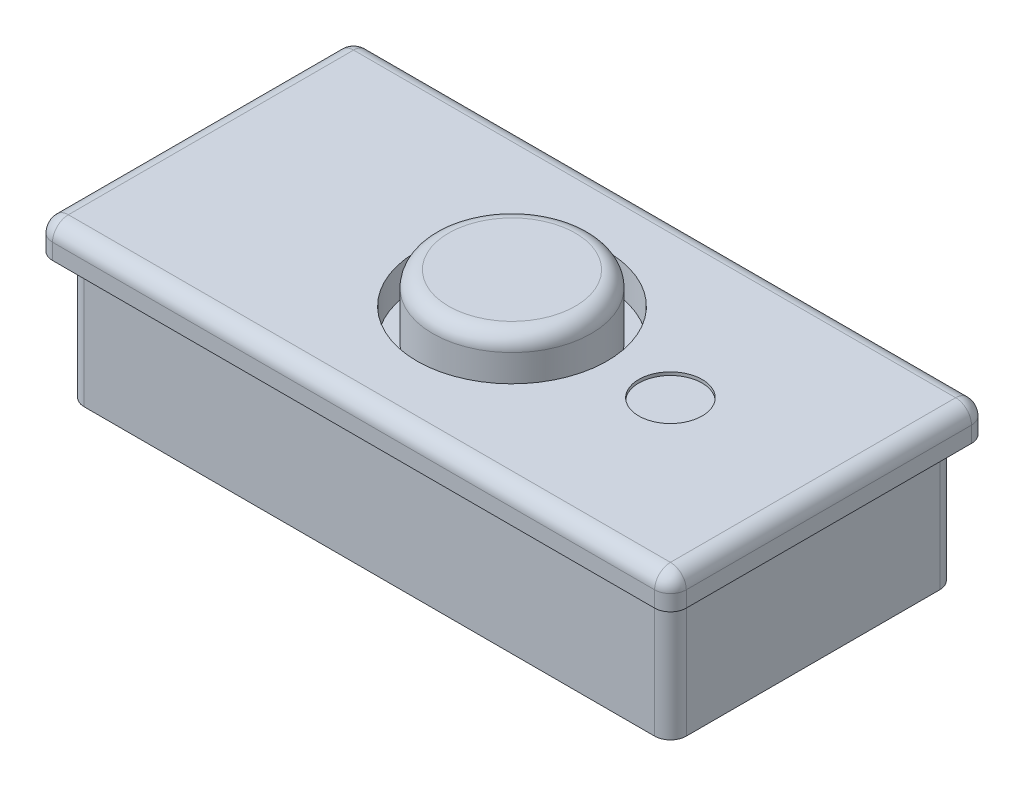
ISO-10303-21;
HEADER;
FILE_DESCRIPTION(('STEP AP214'),'2;1');
FILE_NAME('part.step','',(''),(''),'','','');
FILE_SCHEMA(('AUTOMOTIVE_DESIGN { 1 0 10303 214 1 1 1 1 }'));
ENDSEC;
DATA;
#1=APPLICATION_CONTEXT('core data for automotive mechanical design processes');
#2=APPLICATION_PROTOCOL_DEFINITION('international standard','automotive_design',2000,#1);
#3=PRODUCT_CONTEXT('',#1,'mechanical');
#4=PRODUCT('Part','Part','',(#3));
#5=PRODUCT_RELATED_PRODUCT_CATEGORY('part','',(#4));
#6=PRODUCT_DEFINITION_FORMATION('','',#4);
#7=PRODUCT_DEFINITION_CONTEXT('part definition',#1,'design');
#8=PRODUCT_DEFINITION('design','',#6,#7);
#9=PRODUCT_DEFINITION_SHAPE('','',#8);
#10=(LENGTH_UNIT() NAMED_UNIT(*) SI_UNIT(.MILLI.,.METRE.));
#11=(NAMED_UNIT(*) PLANE_ANGLE_UNIT() SI_UNIT($,.RADIAN.));
#12=(NAMED_UNIT(*) SI_UNIT($,.STERADIAN.) SOLID_ANGLE_UNIT());
#13=UNCERTAINTY_MEASURE_WITH_UNIT(LENGTH_MEASURE(1.E-05),#10,'distance_accuracy_value','');
#14=(GEOMETRIC_REPRESENTATION_CONTEXT(3) GLOBAL_UNCERTAINTY_ASSIGNED_CONTEXT((#13)) GLOBAL_UNIT_ASSIGNED_CONTEXT((#10,
#11,#12)) REPRESENTATION_CONTEXT('',''));
#15=CARTESIAN_POINT('',(0.,0.,0.));
#16=DIRECTION('',(0.,0.,1.));
#17=DIRECTION('',(1.,0.,0.));
#18=AXIS2_PLACEMENT_3D('',#15,#16,#17);
#19=CARTESIAN_POINT('',(1.,0.,-1.));
#20=DIRECTION('',(0.,-1.,0.));
#21=DIRECTION('',(0.,0.,-1.));
#22=AXIS2_PLACEMENT_3D('',#19,#20,#21);
#23=PLANE('',#22);
#24=CARTESIAN_POINT('',(1.,0.,-1.));
#25=DIRECTION('',(0.,1.,0.));
#26=DIRECTION('',(0.,0.,-1.));
#27=AXIS2_PLACEMENT_3D('',#24,#25,#26);
#28=CIRCLE('',#27,1.);
#29=CARTESIAN_POINT('',(0.,0.,-1.00000000000001));
#30=VERTEX_POINT('',#29);
#31=CARTESIAN_POINT('',(1.00000000000001,0.,0.));
#32=VERTEX_POINT('',#31);
#33=EDGE_CURVE('E249',#30,#32,#28,.T.);
#34=ORIENTED_EDGE('',*,*,#33,.F.);
#35=DIRECTION('',(0.,0.,1.));
#36=VECTOR('',#35,1.);
#37=CARTESIAN_POINT('',(0.,0.,-1.00000000000001));
#38=LINE('',#37,#36);
#39=CARTESIAN_POINT('',(0.,0.,-19.));
#40=VERTEX_POINT('',#39);
#41=EDGE_CURVE('E272',#40,#30,#38,.T.);
#42=ORIENTED_EDGE('',*,*,#41,.F.);
#43=CARTESIAN_POINT('',(1.,0.,-19.));
#44=DIRECTION('',(0.,1.,0.));
#45=DIRECTION('',(0.,0.,-1.));
#46=AXIS2_PLACEMENT_3D('',#43,#44,#45);
#47=CIRCLE('',#46,1.);
#48=CARTESIAN_POINT('',(1.00000000000001,0.,-20.));
#49=VERTEX_POINT('',#48);
#50=EDGE_CURVE('E269',#49,#40,#47,.T.);
#51=ORIENTED_EDGE('',*,*,#50,.F.);
#52=DIRECTION('',(-1.,0.,0.));
#53=VECTOR('',#52,1.);
#54=CARTESIAN_POINT('',(1.00000000000001,0.,-20.));
#55=LINE('',#54,#53);
#56=CARTESIAN_POINT('',(39.,0.,-20.));
#57=VERTEX_POINT('',#56);
#58=EDGE_CURVE('E266',#57,#49,#55,.T.);
#59=ORIENTED_EDGE('',*,*,#58,.F.);
#60=CARTESIAN_POINT('',(39.,0.,-19.));
#61=DIRECTION('',(0.,1.,0.));
#62=DIRECTION('',(0.,0.,-1.));
#63=AXIS2_PLACEMENT_3D('',#60,#61,#62);
#64=CIRCLE('',#63,1.);
#65=CARTESIAN_POINT('',(40.,0.,-19.));
#66=VERTEX_POINT('',#65);
#67=EDGE_CURVE('E263',#66,#57,#64,.T.);
#68=ORIENTED_EDGE('',*,*,#67,.F.);
#69=DIRECTION('',(0.,0.,-1.));
#70=VECTOR('',#69,1.);
#71=CARTESIAN_POINT('',(40.,0.,-1.));
#72=LINE('',#71,#70);
#73=CARTESIAN_POINT('',(40.,0.,-1.));
#74=VERTEX_POINT('',#73);
#75=EDGE_CURVE('E260',#74,#66,#72,.T.);
#76=ORIENTED_EDGE('',*,*,#75,.F.);
#77=CARTESIAN_POINT('',(39.,0.,-1.));
#78=DIRECTION('',(0.,1.,0.));
#79=DIRECTION('',(0.,0.,1.));
#80=AXIS2_PLACEMENT_3D('',#77,#78,#79);
#81=CIRCLE('',#80,1.);
#82=CARTESIAN_POINT('',(39.,0.,0.));
#83=VERTEX_POINT('',#82);
#84=EDGE_CURVE('E257',#83,#74,#81,.T.);
#85=ORIENTED_EDGE('',*,*,#84,.F.);
#86=DIRECTION('',(1.,0.,0.));
#87=VECTOR('',#86,1.);
#88=CARTESIAN_POINT('',(1.00000000000001,0.,0.));
#89=LINE('',#88,#87);
#90=EDGE_CURVE('E254',#32,#83,#89,.T.);
#91=ORIENTED_EDGE('',*,*,#90,.F.);
#92=EDGE_LOOP('',(#34,#42,#51,#59,#68,#76,#85,#91));
#93=FACE_BOUND('',#92,.T.);
#94=DIRECTION('',(1.,0.,0.));
#95=VECTOR('',#94,1.);
#96=CARTESIAN_POINT('',(2.00000000000001,0.,-1.));
#97=LINE('',#96,#95);
#98=CARTESIAN_POINT('',(2.00000000000001,0.,-1.));
#99=VERTEX_POINT('',#98);
#100=CARTESIAN_POINT('',(38.,0.,-1.));
#101=VERTEX_POINT('',#100);
#102=EDGE_CURVE('E193',#99,#101,#97,.T.);
#103=ORIENTED_EDGE('',*,*,#102,.T.);
#104=CARTESIAN_POINT('',(38.,0.,-2.));
#105=DIRECTION('',(0.,1.,0.));
#106=DIRECTION('',(0.,0.,1.));
#107=AXIS2_PLACEMENT_3D('',#104,#105,#106);
#108=CIRCLE('',#107,1.);
#109=CARTESIAN_POINT('',(39.,0.,-2.));
#110=VERTEX_POINT('',#109);
#111=EDGE_CURVE('E216',#101,#110,#108,.T.);
#112=ORIENTED_EDGE('',*,*,#111,.T.);
#113=DIRECTION('',(0.,0.,-1.));
#114=VECTOR('',#113,1.);
#115=CARTESIAN_POINT('',(39.,0.,-2.));
#116=LINE('',#115,#114);
#117=CARTESIAN_POINT('',(39.,0.,-18.));
#118=VERTEX_POINT('',#117);
#119=EDGE_CURVE('E172',#110,#118,#116,.T.);
#120=ORIENTED_EDGE('',*,*,#119,.T.);
#121=CARTESIAN_POINT('',(38.,0.,-18.));
#122=DIRECTION('',(0.,1.,0.));
#123=DIRECTION('',(0.,0.,1.));
#124=AXIS2_PLACEMENT_3D('',#121,#122,#123);
#125=CIRCLE('',#124,1.);
#126=CARTESIAN_POINT('',(38.,0.,-19.));
#127=VERTEX_POINT('',#126);
#128=EDGE_CURVE('E219',#118,#127,#125,.T.);
#129=ORIENTED_EDGE('',*,*,#128,.T.);
#130=DIRECTION('',(-1.,0.,0.));
#131=VECTOR('',#130,1.);
#132=CARTESIAN_POINT('',(2.00000000000001,0.,-19.));
#133=LINE('',#132,#131);
#134=CARTESIAN_POINT('',(2.00000000000001,0.,-19.));
#135=VERTEX_POINT('',#134);
#136=EDGE_CURVE('E222',#127,#135,#133,.T.);
#137=ORIENTED_EDGE('',*,*,#136,.T.);
#138=CARTESIAN_POINT('',(2.,0.,-18.));
#139=DIRECTION('',(0.,1.,0.));
#140=DIRECTION('',(0.,0.,1.));
#141=AXIS2_PLACEMENT_3D('',#138,#139,#140);
#142=CIRCLE('',#141,1.);
#143=CARTESIAN_POINT('',(0.999999999999999,0.,-18.));
#144=VERTEX_POINT('',#143);
#145=EDGE_CURVE('E225',#135,#144,#142,.T.);
#146=ORIENTED_EDGE('',*,*,#145,.T.);
#147=DIRECTION('',(0.,0.,1.));
#148=VECTOR('',#147,1.);
#149=CARTESIAN_POINT('',(0.999999999999999,0.,-2.00000000000001));
#150=LINE('',#149,#148);
#151=CARTESIAN_POINT('',(0.999999999999999,0.,-2.00000000000001));
#152=VERTEX_POINT('',#151);
#153=EDGE_CURVE('E228',#144,#152,#150,.T.);
#154=ORIENTED_EDGE('',*,*,#153,.T.);
#155=CARTESIAN_POINT('',(2.,0.,-2.));
#156=DIRECTION('',(0.,1.,0.));
#157=DIRECTION('',(0.,0.,-1.));
#158=AXIS2_PLACEMENT_3D('',#155,#156,#157);
#159=CIRCLE('',#158,1.);
#160=EDGE_CURVE('E196',#152,#99,#159,.T.);
#161=ORIENTED_EDGE('',*,*,#160,.T.);
#162=EDGE_LOOP('',(#103,#112,#120,#129,#137,#146,#154,#161));
#163=FACE_BOUND('',#162,.T.);
#164=ADVANCED_FACE('F39',(#93,#163),#23,.T.);
#165=CARTESIAN_POINT('',(1.,2.,-1.));
#166=DIRECTION('',(0.,-1.,0.));
#167=DIRECTION('',(0.,0.,-1.));
#168=AXIS2_PLACEMENT_3D('',#165,#166,#167);
#169=PLANE('',#168);
#170=DIRECTION('',(0.,0.,1.));
#171=VECTOR('',#170,1.);
#172=CARTESIAN_POINT('',(1.,2.,-1.));
#173=LINE('',#172,#171);
#174=CARTESIAN_POINT('',(1.,2.,-19.));
#175=VERTEX_POINT('',#174);
#176=CARTESIAN_POINT('',(1.,2.,-1.));
#177=VERTEX_POINT('',#176);
#178=EDGE_CURVE('E298',#175,#177,#173,.T.);
#179=ORIENTED_EDGE('',*,*,#178,.T.);
#180=DIRECTION('',(1.,0.,0.));
#181=VECTOR('',#180,1.);
#182=CARTESIAN_POINT('',(1.,2.,-1.));
#183=LINE('',#182,#181);
#184=CARTESIAN_POINT('',(39.,2.,-1.));
#185=VERTEX_POINT('',#184);
#186=EDGE_CURVE('E300',#177,#185,#183,.T.);
#187=ORIENTED_EDGE('',*,*,#186,.T.);
#188=DIRECTION('',(0.,0.,-1.));
#189=VECTOR('',#188,1.);
#190=CARTESIAN_POINT('',(39.,2.,-1.));
#191=LINE('',#190,#189);
#192=CARTESIAN_POINT('',(39.,2.,-19.));
#193=VERTEX_POINT('',#192);
#194=EDGE_CURVE('E294',#185,#193,#191,.T.);
#195=ORIENTED_EDGE('',*,*,#194,.T.);
#196=DIRECTION('',(-1.,0.,0.));
#197=VECTOR('',#196,1.);
#198=CARTESIAN_POINT('',(1.,2.,-19.));
#199=LINE('',#198,#197);
#200=EDGE_CURVE('E296',#193,#175,#199,.T.);
#201=ORIENTED_EDGE('',*,*,#200,.T.);
#202=EDGE_LOOP('',(#179,#187,#195,#201));
#203=FACE_BOUND('',#202,.T.);
#204=CARTESIAN_POINT('',(30.,2.,-10.));
#205=DIRECTION('',(0.,1.,0.));
#206=DIRECTION('',(0.,0.,1.));
#207=AXIS2_PLACEMENT_3D('',#204,#205,#206);
#208=CIRCLE('',#207,2.);
#209=CARTESIAN_POINT('',(30.,2.,-8.));
#210=VERTEX_POINT('',#209);
#211=EDGE_CURVE('E339',#210,#210,#208,.T.);
#212=ORIENTED_EDGE('',*,*,#211,.F.);
#213=EDGE_LOOP('',(#212));
#214=FACE_BOUND('',#213,.T.);
#215=CARTESIAN_POINT('',(20.,2.,-10.));
#216=DIRECTION('',(0.,1.,0.));
#217=DIRECTION('',(0.,0.,1.));
#218=AXIS2_PLACEMENT_3D('',#215,#216,#217);
#219=CIRCLE('',#218,6.);
#220=CARTESIAN_POINT('',(20.,2.,-4.));
#221=VERTEX_POINT('',#220);
#222=EDGE_CURVE('E246',#221,#221,#219,.T.);
#223=ORIENTED_EDGE('',*,*,#222,.F.);
#224=EDGE_LOOP('',(#223));
#225=FACE_BOUND('',#224,.T.);
#226=ADVANCED_FACE('F378',(#203,#214,#225),#169,.F.);
#227=CARTESIAN_POINT('',(1.,2.,-1.));
#228=DIRECTION('',(0.,-1.,0.));
#229=DIRECTION('',(0.,0.,-1.));
#230=AXIS2_PLACEMENT_3D('',#227,#228,#229);
#231=CYLINDRICAL_SURFACE('',#230,1.);
#232=DIRECTION('',(0.,-1.,0.));
#233=VECTOR('',#232,1.);
#234=CARTESIAN_POINT('',(1.00000000000001,2.,0.));
#235=LINE('',#234,#233);
#236=CARTESIAN_POINT('',(1.00000000000001,1.,0.));
#237=VERTEX_POINT('',#236);
#238=EDGE_CURVE('E289',#237,#32,#235,.T.);
#239=ORIENTED_EDGE('',*,*,#238,.F.);
#240=CARTESIAN_POINT('',(1.,1.,-1.));
#241=DIRECTION('',(0.,-1.,0.));
#242=DIRECTION('',(0.,0.,-1.));
#243=AXIS2_PLACEMENT_3D('',#240,#241,#242);
#244=CIRCLE('',#243,1.);
#245=CARTESIAN_POINT('',(0.,1.,-1.00000000000001));
#246=VERTEX_POINT('',#245);
#247=EDGE_CURVE('E305',#237,#246,#244,.T.);
#248=ORIENTED_EDGE('',*,*,#247,.T.);
#249=DIRECTION('',(0.,-1.,0.));
#250=VECTOR('',#249,1.);
#251=CARTESIAN_POINT('',(0.,2.,-1.00000000000001));
#252=LINE('',#251,#250);
#253=EDGE_CURVE('E275',#246,#30,#252,.T.);
#254=ORIENTED_EDGE('',*,*,#253,.T.);
#255=ORIENTED_EDGE('',*,*,#33,.T.);
#256=EDGE_LOOP('',(#239,#248,#254,#255));
#257=FACE_BOUND('',#256,.T.);
#258=ADVANCED_FACE('F384',(#257),#231,.T.);
#259=CARTESIAN_POINT('',(1.00000000000001,2.,0.));
#260=DIRECTION('',(0.,0.,-1.));
#261=DIRECTION('',(-1.,0.,0.));
#262=AXIS2_PLACEMENT_3D('',#259,#260,#261);
#263=PLANE('',#262);
#264=DIRECTION('',(0.,-1.,0.));
#265=VECTOR('',#264,1.);
#266=CARTESIAN_POINT('',(39.,2.,0.));
#267=LINE('',#266,#265);
#268=CARTESIAN_POINT('',(39.,1.,0.));
#269=VERTEX_POINT('',#268);
#270=EDGE_CURVE('E287',#269,#83,#267,.T.);
#271=ORIENTED_EDGE('',*,*,#270,.F.);
#272=DIRECTION('',(1.,0.,0.));
#273=VECTOR('',#272,1.);
#274=CARTESIAN_POINT('',(1.00000000000001,1.,0.));
#275=LINE('',#274,#273);
#276=EDGE_CURVE('E303',#269,#237,#275,.F.);
#277=ORIENTED_EDGE('',*,*,#276,.T.);
#278=ORIENTED_EDGE('',*,*,#238,.T.);
#279=ORIENTED_EDGE('',*,*,#90,.T.);
#280=EDGE_LOOP('',(#271,#277,#278,#279));
#281=FACE_BOUND('',#280,.T.);
#282=ADVANCED_FACE('F405',(#281),#263,.F.);
#283=CARTESIAN_POINT('',(39.,2.,-1.));
#284=DIRECTION('',(0.,-1.,0.));
#285=DIRECTION('',(0.,0.,-1.));
#286=AXIS2_PLACEMENT_3D('',#283,#284,#285);
#287=CYLINDRICAL_SURFACE('',#286,1.);
#288=DIRECTION('',(0.,-1.,0.));
#289=VECTOR('',#288,1.);
#290=CARTESIAN_POINT('',(40.,2.,-1.));
#291=LINE('',#290,#289);
#292=CARTESIAN_POINT('',(40.,1.,-1.));
#293=VERTEX_POINT('',#292);
#294=EDGE_CURVE('E285',#293,#74,#291,.T.);
#295=ORIENTED_EDGE('',*,*,#294,.F.);
#296=CARTESIAN_POINT('',(39.,1.,-1.));
#297=DIRECTION('',(0.,-1.,0.));
#298=DIRECTION('',(0.,0.,-1.));
#299=AXIS2_PLACEMENT_3D('',#296,#297,#298);
#300=CIRCLE('',#299,1.);
#301=EDGE_CURVE('E291',#293,#269,#300,.T.);
#302=ORIENTED_EDGE('',*,*,#301,.T.);
#303=ORIENTED_EDGE('',*,*,#270,.T.);
#304=ORIENTED_EDGE('',*,*,#84,.T.);
#305=EDGE_LOOP('',(#295,#302,#303,#304));
#306=FACE_BOUND('',#305,.T.);
#307=ADVANCED_FACE('F401',(#306),#287,.T.);
#308=CARTESIAN_POINT('',(40.,2.,-1.));
#309=DIRECTION('',(-1.,0.,0.));
#310=DIRECTION('',(0.,0.,1.));
#311=AXIS2_PLACEMENT_3D('',#308,#309,#310);
#312=PLANE('',#311);
#313=DIRECTION('',(0.,-1.,0.));
#314=VECTOR('',#313,1.);
#315=CARTESIAN_POINT('',(40.,2.,-19.));
#316=LINE('',#315,#314);
#317=CARTESIAN_POINT('',(40.,1.,-19.));
#318=VERTEX_POINT('',#317);
#319=EDGE_CURVE('E283',#318,#66,#316,.T.);
#320=ORIENTED_EDGE('',*,*,#319,.F.);
#321=DIRECTION('',(0.,0.,-1.));
#322=VECTOR('',#321,1.);
#323=CARTESIAN_POINT('',(40.,1.,-1.));
#324=LINE('',#323,#322);
#325=EDGE_CURVE('E313',#318,#293,#324,.F.);
#326=ORIENTED_EDGE('',*,*,#325,.T.);
#327=ORIENTED_EDGE('',*,*,#294,.T.);
#328=ORIENTED_EDGE('',*,*,#75,.T.);
#329=EDGE_LOOP('',(#320,#326,#327,#328));
#330=FACE_BOUND('',#329,.T.);
#331=ADVANCED_FACE('F398',(#330),#312,.F.);
#332=CARTESIAN_POINT('',(39.,2.,-19.));
#333=DIRECTION('',(0.,-1.,0.));
#334=DIRECTION('',(0.,0.,-1.));
#335=AXIS2_PLACEMENT_3D('',#332,#333,#334);
#336=CYLINDRICAL_SURFACE('',#335,1.);
#337=DIRECTION('',(0.,-1.,0.));
#338=VECTOR('',#337,1.);
#339=CARTESIAN_POINT('',(39.,2.,-20.));
#340=LINE('',#339,#338);
#341=CARTESIAN_POINT('',(39.,1.,-20.));
#342=VERTEX_POINT('',#341);
#343=EDGE_CURVE('E281',#342,#57,#340,.T.);
#344=ORIENTED_EDGE('',*,*,#343,.F.);
#345=CARTESIAN_POINT('',(39.,1.,-19.));
#346=DIRECTION('',(0.,-1.,0.));
#347=DIRECTION('',(0.,0.,-1.));
#348=AXIS2_PLACEMENT_3D('',#345,#346,#347);
#349=CIRCLE('',#348,1.);
#350=EDGE_CURVE('E56',#342,#318,#349,.T.);
#351=ORIENTED_EDGE('',*,*,#350,.T.);
#352=ORIENTED_EDGE('',*,*,#319,.T.);
#353=ORIENTED_EDGE('',*,*,#67,.T.);
#354=EDGE_LOOP('',(#344,#351,#352,#353));
#355=FACE_BOUND('',#354,.T.);
#356=ADVANCED_FACE('F395',(#355),#336,.T.);
#357=CARTESIAN_POINT('',(1.00000000000001,2.,-20.));
#358=DIRECTION('',(0.,0.,1.));
#359=DIRECTION('',(1.,0.,0.));
#360=AXIS2_PLACEMENT_3D('',#357,#358,#359);
#361=PLANE('',#360);
#362=DIRECTION('',(0.,-1.,0.));
#363=VECTOR('',#362,1.);
#364=CARTESIAN_POINT('',(1.00000000000001,2.,-20.));
#365=LINE('',#364,#363);
#366=CARTESIAN_POINT('',(1.00000000000001,1.,-20.));
#367=VERTEX_POINT('',#366);
#368=EDGE_CURVE('E279',#367,#49,#365,.T.);
#369=ORIENTED_EDGE('',*,*,#368,.F.);
#370=DIRECTION('',(-1.,0.,0.));
#371=VECTOR('',#370,1.);
#372=CARTESIAN_POINT('',(1.00000000000001,1.,-20.));
#373=LINE('',#372,#371);
#374=EDGE_CURVE('E64',#367,#342,#373,.F.);
#375=ORIENTED_EDGE('',*,*,#374,.T.);
#376=ORIENTED_EDGE('',*,*,#343,.T.);
#377=ORIENTED_EDGE('',*,*,#58,.T.);
#378=EDGE_LOOP('',(#369,#375,#376,#377));
#379=FACE_BOUND('',#378,.T.);
#380=ADVANCED_FACE('F391',(#379),#361,.F.);
#381=CARTESIAN_POINT('',(1.,2.,-19.));
#382=DIRECTION('',(0.,-1.,0.));
#383=DIRECTION('',(0.,0.,-1.));
#384=AXIS2_PLACEMENT_3D('',#381,#382,#383);
#385=CYLINDRICAL_SURFACE('',#384,1.);
#386=DIRECTION('',(0.,-1.,0.));
#387=VECTOR('',#386,1.);
#388=CARTESIAN_POINT('',(0.,2.,-19.));
#389=LINE('',#388,#387);
#390=CARTESIAN_POINT('',(0.,1.,-19.));
#391=VERTEX_POINT('',#390);
#392=EDGE_CURVE('E277',#391,#40,#389,.T.);
#393=ORIENTED_EDGE('',*,*,#392,.F.);
#394=CARTESIAN_POINT('',(1.,1.,-19.));
#395=DIRECTION('',(0.,-1.,0.));
#396=DIRECTION('',(0.,0.,-1.));
#397=AXIS2_PLACEMENT_3D('',#394,#395,#396);
#398=CIRCLE('',#397,1.);
#399=EDGE_CURVE('E309',#391,#367,#398,.T.);
#400=ORIENTED_EDGE('',*,*,#399,.T.);
#401=ORIENTED_EDGE('',*,*,#368,.T.);
#402=ORIENTED_EDGE('',*,*,#50,.T.);
#403=EDGE_LOOP('',(#393,#400,#401,#402));
#404=FACE_BOUND('',#403,.T.);
#405=ADVANCED_FACE('F373',(#404),#385,.T.);
#406=CARTESIAN_POINT('',(0.,2.,-1.00000000000001));
#407=DIRECTION('',(1.,0.,0.));
#408=DIRECTION('',(0.,0.,-1.));
#409=AXIS2_PLACEMENT_3D('',#406,#407,#408);
#410=PLANE('',#409);
#411=ORIENTED_EDGE('',*,*,#253,.F.);
#412=DIRECTION('',(0.,0.,1.));
#413=VECTOR('',#412,1.);
#414=CARTESIAN_POINT('',(0.,1.,-1.00000000000001));
#415=LINE('',#414,#413);
#416=EDGE_CURVE('E307',#246,#391,#415,.F.);
#417=ORIENTED_EDGE('',*,*,#416,.T.);
#418=ORIENTED_EDGE('',*,*,#392,.T.);
#419=ORIENTED_EDGE('',*,*,#41,.T.);
#420=EDGE_LOOP('',(#411,#417,#418,#419));
#421=FACE_BOUND('',#420,.T.);
#422=ADVANCED_FACE('F364',(#421),#410,.F.);
#423=CARTESIAN_POINT('',(20.,2.,-10.));
#424=DIRECTION('',(0.,-1.,0.));
#425=DIRECTION('',(0.,0.,-1.));
#426=AXIS2_PLACEMENT_3D('',#423,#424,#425);
#427=CYLINDRICAL_SURFACE('',#426,6.);
#428=ORIENTED_EDGE('',*,*,#222,.T.);
#429=EDGE_LOOP('',(#428));
#430=FACE_BOUND('',#429,.T.);
#431=CARTESIAN_POINT('',(20.,0.,-10.));
#432=DIRECTION('',(0.,1.,0.));
#433=DIRECTION('',(0.,0.,1.));
#434=AXIS2_PLACEMENT_3D('',#431,#432,#433);
#435=CIRCLE('',#434,6.);
#436=CARTESIAN_POINT('',(20.,0.,-4.));
#437=VERTEX_POINT('',#436);
#438=EDGE_CURVE('E234',#437,#437,#435,.T.);
#439=ORIENTED_EDGE('',*,*,#438,.F.);
#440=EDGE_LOOP('',(#439));
#441=FACE_BOUND('',#440,.T.);
#442=ADVANCED_FACE('F362',(#430,#441),#427,.F.);
#443=CARTESIAN_POINT('',(38.,-8.,-2.));
#444=DIRECTION('',(0.,1.,0.));
#445=DIRECTION('',(0.,0.,1.));
#446=AXIS2_PLACEMENT_3D('',#443,#444,#445);
#447=PLANE('',#446);
#448=CARTESIAN_POINT('',(38.,-8.,-2.));
#449=DIRECTION('',(0.,1.,0.));
#450=DIRECTION('',(0.,0.,1.));
#451=AXIS2_PLACEMENT_3D('',#448,#449,#450);
#452=CIRCLE('',#451,1.);
#453=CARTESIAN_POINT('',(38.,-8.,-1.));
#454=VERTEX_POINT('',#453);
#455=CARTESIAN_POINT('',(39.,-8.,-2.));
#456=VERTEX_POINT('',#455);
#457=EDGE_CURVE('E184',#454,#456,#452,.T.);
#458=ORIENTED_EDGE('',*,*,#457,.F.);
#459=DIRECTION('',(1.,0.,0.));
#460=VECTOR('',#459,1.);
#461=CARTESIAN_POINT('',(2.00000000000001,-8.,-1.));
#462=LINE('',#461,#460);
#463=CARTESIAN_POINT('',(2.00000000000001,-8.,-1.));
#464=VERTEX_POINT('',#463);
#465=EDGE_CURVE('E177',#464,#454,#462,.T.);
#466=ORIENTED_EDGE('',*,*,#465,.F.);
#467=CARTESIAN_POINT('',(2.,-8.,-2.));
#468=DIRECTION('',(0.,1.,0.));
#469=DIRECTION('',(0.,0.,-1.));
#470=AXIS2_PLACEMENT_3D('',#467,#468,#469);
#471=CIRCLE('',#470,1.);
#472=CARTESIAN_POINT('',(0.999999999999999,-8.,-2.00000000000001));
#473=VERTEX_POINT('',#472);
#474=EDGE_CURVE('E212',#473,#464,#471,.T.);
#475=ORIENTED_EDGE('',*,*,#474,.F.);
#476=DIRECTION('',(0.,0.,1.));
#477=VECTOR('',#476,1.);
#478=CARTESIAN_POINT('',(0.999999999999999,-8.,-2.00000000000001));
#479=LINE('',#478,#477);
#480=CARTESIAN_POINT('',(0.999999999999999,-8.,-18.));
#481=VERTEX_POINT('',#480);
#482=EDGE_CURVE('E209',#481,#473,#479,.T.);
#483=ORIENTED_EDGE('',*,*,#482,.F.);
#484=CARTESIAN_POINT('',(2.,-8.,-18.));
#485=DIRECTION('',(0.,1.,0.));
#486=DIRECTION('',(0.,0.,1.));
#487=AXIS2_PLACEMENT_3D('',#484,#485,#486);
#488=CIRCLE('',#487,1.);
#489=CARTESIAN_POINT('',(2.00000000000001,-8.,-19.));
#490=VERTEX_POINT('',#489);
#491=EDGE_CURVE('E206',#490,#481,#488,.T.);
#492=ORIENTED_EDGE('',*,*,#491,.F.);
#493=DIRECTION('',(-1.,0.,0.));
#494=VECTOR('',#493,1.);
#495=CARTESIAN_POINT('',(2.00000000000001,-8.,-19.));
#496=LINE('',#495,#494);
#497=CARTESIAN_POINT('',(38.,-8.,-19.));
#498=VERTEX_POINT('',#497);
#499=EDGE_CURVE('E203',#498,#490,#496,.T.);
#500=ORIENTED_EDGE('',*,*,#499,.F.);
#501=CARTESIAN_POINT('',(38.,-8.,-18.));
#502=DIRECTION('',(0.,1.,0.));
#503=DIRECTION('',(0.,0.,1.));
#504=AXIS2_PLACEMENT_3D('',#501,#502,#503);
#505=CIRCLE('',#504,1.);
#506=CARTESIAN_POINT('',(39.,-8.,-18.));
#507=VERTEX_POINT('',#506);
#508=EDGE_CURVE('E188',#507,#498,#505,.T.);
#509=ORIENTED_EDGE('',*,*,#508,.F.);
#510=DIRECTION('',(0.,0.,-1.));
#511=VECTOR('',#510,1.);
#512=CARTESIAN_POINT('',(39.,-8.,-2.));
#513=LINE('',#512,#511);
#514=EDGE_CURVE('E170',#456,#507,#513,.T.);
#515=ORIENTED_EDGE('',*,*,#514,.F.);
#516=EDGE_LOOP('',(#458,#466,#475,#483,#492,#500,#509,#515));
#517=FACE_BOUND('',#516,.T.);
#518=ADVANCED_FACE('F182',(#517),#447,.F.);
#519=CARTESIAN_POINT('',(39.,-8.,-2.));
#520=DIRECTION('',(1.,0.,0.));
#521=DIRECTION('',(0.,0.,-1.));
#522=AXIS2_PLACEMENT_3D('',#519,#520,#521);
#523=PLANE('',#522);
#524=ORIENTED_EDGE('',*,*,#119,.F.);
#525=DIRECTION('',(0.,1.,0.));
#526=VECTOR('',#525,1.);
#527=CARTESIAN_POINT('',(39.,-8.,-2.));
#528=LINE('',#527,#526);
#529=EDGE_CURVE('E167',#456,#110,#528,.T.);
#530=ORIENTED_EDGE('',*,*,#529,.F.);
#531=ORIENTED_EDGE('',*,*,#514,.T.);
#532=DIRECTION('',(0.,1.,0.));
#533=VECTOR('',#532,1.);
#534=CARTESIAN_POINT('',(39.,-8.,-18.));
#535=LINE('',#534,#533);
#536=EDGE_CURVE('E176',#507,#118,#535,.T.);
#537=ORIENTED_EDGE('',*,*,#536,.T.);
#538=EDGE_LOOP('',(#524,#530,#531,#537));
#539=FACE_BOUND('',#538,.T.);
#540=ADVANCED_FACE('F169',(#539),#523,.T.);
#541=CARTESIAN_POINT('',(38.,-8.,-18.));
#542=DIRECTION('',(0.,1.,0.));
#543=DIRECTION('',(0.,0.,1.));
#544=AXIS2_PLACEMENT_3D('',#541,#542,#543);
#545=CYLINDRICAL_SURFACE('',#544,1.);
#546=ORIENTED_EDGE('',*,*,#128,.F.);
#547=ORIENTED_EDGE('',*,*,#536,.F.);
#548=ORIENTED_EDGE('',*,*,#508,.T.);
#549=DIRECTION('',(0.,1.,0.));
#550=VECTOR('',#549,1.);
#551=CARTESIAN_POINT('',(38.,-8.,-19.));
#552=LINE('',#551,#550);
#553=EDGE_CURVE('E243',#498,#127,#552,.T.);
#554=ORIENTED_EDGE('',*,*,#553,.T.);
#555=EDGE_LOOP('',(#546,#547,#548,#554));
#556=FACE_BOUND('',#555,.T.);
#557=ADVANCED_FACE('F507',(#556),#545,.T.);
#558=CARTESIAN_POINT('',(2.00000000000001,-8.,-19.));
#559=DIRECTION('',(0.,0.,-1.));
#560=DIRECTION('',(-1.,0.,0.));
#561=AXIS2_PLACEMENT_3D('',#558,#559,#560);
#562=PLANE('',#561);
#563=ORIENTED_EDGE('',*,*,#136,.F.);
#564=ORIENTED_EDGE('',*,*,#553,.F.);
#565=ORIENTED_EDGE('',*,*,#499,.T.);
#566=DIRECTION('',(0.,1.,0.));
#567=VECTOR('',#566,1.);
#568=CARTESIAN_POINT('',(2.00000000000001,-8.,-19.));
#569=LINE('',#568,#567);
#570=EDGE_CURVE('E241',#490,#135,#569,.T.);
#571=ORIENTED_EDGE('',*,*,#570,.T.);
#572=EDGE_LOOP('',(#563,#564,#565,#571));
#573=FACE_BOUND('',#572,.T.);
#574=ADVANCED_FACE('F503',(#573),#562,.T.);
#575=CARTESIAN_POINT('',(2.,-8.,-18.));
#576=DIRECTION('',(0.,1.,0.));
#577=DIRECTION('',(0.,0.,1.));
#578=AXIS2_PLACEMENT_3D('',#575,#576,#577);
#579=CYLINDRICAL_SURFACE('',#578,1.);
#580=ORIENTED_EDGE('',*,*,#145,.F.);
#581=ORIENTED_EDGE('',*,*,#570,.F.);
#582=ORIENTED_EDGE('',*,*,#491,.T.);
#583=DIRECTION('',(0.,1.,0.));
#584=VECTOR('',#583,1.);
#585=CARTESIAN_POINT('',(0.999999999999999,-8.,-18.));
#586=LINE('',#585,#584);
#587=EDGE_CURVE('E239',#481,#144,#586,.T.);
#588=ORIENTED_EDGE('',*,*,#587,.T.);
#589=EDGE_LOOP('',(#580,#581,#582,#588));
#590=FACE_BOUND('',#589,.T.);
#591=ADVANCED_FACE('F499',(#590),#579,.T.);
#592=CARTESIAN_POINT('',(0.999999999999999,-8.,-2.00000000000001));
#593=DIRECTION('',(-1.,0.,0.));
#594=DIRECTION('',(0.,0.,1.));
#595=AXIS2_PLACEMENT_3D('',#592,#593,#594);
#596=PLANE('',#595);
#597=ORIENTED_EDGE('',*,*,#153,.F.);
#598=ORIENTED_EDGE('',*,*,#587,.F.);
#599=ORIENTED_EDGE('',*,*,#482,.T.);
#600=DIRECTION('',(0.,1.,0.));
#601=VECTOR('',#600,1.);
#602=CARTESIAN_POINT('',(0.999999999999999,-8.,-2.00000000000001));
#603=LINE('',#602,#601);
#604=EDGE_CURVE('E237',#473,#152,#603,.T.);
#605=ORIENTED_EDGE('',*,*,#604,.T.);
#606=EDGE_LOOP('',(#597,#598,#599,#605));
#607=FACE_BOUND('',#606,.T.);
#608=ADVANCED_FACE('F495',(#607),#596,.T.);
#609=CARTESIAN_POINT('',(2.,-8.,-2.));
#610=DIRECTION('',(0.,1.,0.));
#611=DIRECTION('',(0.,0.,1.));
#612=AXIS2_PLACEMENT_3D('',#609,#610,#611);
#613=CYLINDRICAL_SURFACE('',#612,1.);
#614=ORIENTED_EDGE('',*,*,#160,.F.);
#615=ORIENTED_EDGE('',*,*,#604,.F.);
#616=ORIENTED_EDGE('',*,*,#474,.T.);
#617=DIRECTION('',(0.,1.,0.));
#618=VECTOR('',#617,1.);
#619=CARTESIAN_POINT('',(2.00000000000001,-8.,-1.));
#620=LINE('',#619,#618);
#621=EDGE_CURVE('E235',#464,#99,#620,.T.);
#622=ORIENTED_EDGE('',*,*,#621,.T.);
#623=EDGE_LOOP('',(#614,#615,#616,#622));
#624=FACE_BOUND('',#623,.T.);
#625=ADVANCED_FACE('F491',(#624),#613,.T.);
#626=CARTESIAN_POINT('',(2.00000000000001,-8.,-1.));
#627=DIRECTION('',(0.,0.,1.));
#628=DIRECTION('',(1.,0.,0.));
#629=AXIS2_PLACEMENT_3D('',#626,#627,#628);
#630=PLANE('',#629);
#631=ORIENTED_EDGE('',*,*,#102,.F.);
#632=ORIENTED_EDGE('',*,*,#621,.F.);
#633=ORIENTED_EDGE('',*,*,#465,.T.);
#634=DIRECTION('',(0.,1.,0.));
#635=VECTOR('',#634,1.);
#636=CARTESIAN_POINT('',(38.,-8.,-1.));
#637=LINE('',#636,#635);
#638=EDGE_CURVE('E192',#454,#101,#637,.T.);
#639=ORIENTED_EDGE('',*,*,#638,.T.);
#640=EDGE_LOOP('',(#631,#632,#633,#639));
#641=FACE_BOUND('',#640,.T.);
#642=ADVANCED_FACE('F488',(#641),#630,.T.);
#643=CARTESIAN_POINT('',(38.,-8.,-2.));
#644=DIRECTION('',(0.,1.,0.));
#645=DIRECTION('',(0.,0.,1.));
#646=AXIS2_PLACEMENT_3D('',#643,#644,#645);
#647=CYLINDRICAL_SURFACE('',#646,1.);
#648=ORIENTED_EDGE('',*,*,#111,.F.);
#649=ORIENTED_EDGE('',*,*,#638,.F.);
#650=ORIENTED_EDGE('',*,*,#457,.T.);
#651=ORIENTED_EDGE('',*,*,#529,.T.);
#652=EDGE_LOOP('',(#648,#649,#650,#651));
#653=FACE_BOUND('',#652,.T.);
#654=ADVANCED_FACE('F190',(#653),#647,.T.);
#655=CARTESIAN_POINT('',(38.,0.,-2.));
#656=DIRECTION('',(0.,1.,0.));
#657=DIRECTION('',(0.,0.,1.));
#658=AXIS2_PLACEMENT_3D('',#655,#656,#657);
#659=PLANE('',#658);
#660=CARTESIAN_POINT('',(20.,0.,-10.));
#661=DIRECTION('',(0.,1.,0.));
#662=DIRECTION('',(0.,0.,1.));
#663=AXIS2_PLACEMENT_3D('',#660,#661,#662);
#664=CIRCLE('',#663,5.);
#665=CARTESIAN_POINT('',(20.,0.,-5.));
#666=VERTEX_POINT('',#665);
#667=EDGE_CURVE('E199',#666,#666,#664,.T.);
#668=ORIENTED_EDGE('',*,*,#667,.F.);
#669=EDGE_LOOP('',(#668));
#670=FACE_BOUND('',#669,.T.);
#671=ORIENTED_EDGE('',*,*,#438,.T.);
#672=EDGE_LOOP('',(#671));
#673=FACE_BOUND('',#672,.T.);
#674=ADVANCED_FACE('F356',(#670,#673),#659,.T.);
#675=CARTESIAN_POINT('',(20.,4.,-10.));
#676=DIRECTION('',(0.,-1.,0.));
#677=DIRECTION('',(0.,0.,-1.));
#678=AXIS2_PLACEMENT_3D('',#675,#676,#677);
#679=CYLINDRICAL_SURFACE('',#678,5.);
#680=CARTESIAN_POINT('',(20.,3.,-10.));
#681=DIRECTION('',(0.,1.,0.));
#682=DIRECTION('',(0.,0.,1.));
#683=AXIS2_PLACEMENT_3D('',#680,#681,#682);
#684=CIRCLE('',#683,5.);
#685=CARTESIAN_POINT('',(20.,3.,-5.));
#686=VERTEX_POINT('',#685);
#687=EDGE_CURVE('E11',#686,#686,#684,.F.);
#688=ORIENTED_EDGE('',*,*,#687,.T.);
#689=EDGE_LOOP('',(#688));
#690=FACE_BOUND('',#689,.T.);
#691=ORIENTED_EDGE('',*,*,#667,.T.);
#692=EDGE_LOOP('',(#691));
#693=FACE_BOUND('',#692,.T.);
#694=ADVANCED_FACE('F354',(#690,#693),#679,.T.);
#695=CARTESIAN_POINT('',(20.,4.,-10.));
#696=DIRECTION('',(0.,1.,0.));
#697=DIRECTION('',(0.,0.,1.));
#698=AXIS2_PLACEMENT_3D('',#695,#696,#697);
#699=PLANE('',#698);
#700=CARTESIAN_POINT('',(20.,4.,-10.));
#701=DIRECTION('',(0.,1.,0.));
#702=DIRECTION('',(0.,0.,1.));
#703=AXIS2_PLACEMENT_3D('',#700,#701,#702);
#704=CIRCLE('',#703,4.);
#705=CARTESIAN_POINT('',(20.,4.,-6.));
#706=VERTEX_POINT('',#705);
#707=EDGE_CURVE('E48',#706,#706,#704,.T.);
#708=ORIENTED_EDGE('',*,*,#707,.T.);
#709=EDGE_LOOP('',(#708));
#710=FACE_BOUND('',#709,.T.);
#711=ADVANCED_FACE('F479',(#710),#699,.T.);
#712=CARTESIAN_POINT('',(30.,1.8,-10.));
#713=DIRECTION('',(0.,1.,0.));
#714=DIRECTION('',(0.,0.,1.));
#715=AXIS2_PLACEMENT_3D('',#712,#713,#714);
#716=CYLINDRICAL_SURFACE('',#715,2.);
#717=CARTESIAN_POINT('',(30.,1.8,-10.));
#718=DIRECTION('',(0.,1.,0.));
#719=DIRECTION('',(0.,0.,1.));
#720=AXIS2_PLACEMENT_3D('',#717,#718,#719);
#721=CIRCLE('',#720,2.);
#722=CARTESIAN_POINT('',(30.,1.8,-8.));
#723=VERTEX_POINT('',#722);
#724=EDGE_CURVE('E344',#723,#723,#721,.T.);
#725=ORIENTED_EDGE('',*,*,#724,.F.);
#726=EDGE_LOOP('',(#725));
#727=FACE_BOUND('',#726,.T.);
#728=ORIENTED_EDGE('',*,*,#211,.T.);
#729=EDGE_LOOP('',(#728));
#730=FACE_BOUND('',#729,.T.);
#731=ADVANCED_FACE('F446',(#727,#730),#716,.F.);
#732=CARTESIAN_POINT('',(30.,1.8,-10.));
#733=DIRECTION('',(0.,1.,0.));
#734=DIRECTION('',(0.,0.,1.));
#735=AXIS2_PLACEMENT_3D('',#732,#733,#734);
#736=PLANE('',#735);
#737=ORIENTED_EDGE('',*,*,#724,.T.);
#738=EDGE_LOOP('',(#737));
#739=FACE_BOUND('',#738,.T.);
#740=ADVANCED_FACE('F440',(#739),#736,.T.);
#741=CARTESIAN_POINT('',(1.,1.,-19.));
#742=DIRECTION('',(0.,-1.,0.));
#743=DIRECTION('',(0.,0.,-1.));
#744=AXIS2_PLACEMENT_3D('',#741,#742,#743);
#745=SPHERICAL_SURFACE('',#744,1.);
#746=CARTESIAN_POINT('',(1.,1.,-19.));
#747=DIRECTION('',(1.,0.,0.));
#748=DIRECTION('',(0.,0.,-1.));
#749=AXIS2_PLACEMENT_3D('',#746,#747,#748);
#750=CIRCLE('',#749,1.);
#751=EDGE_CURVE('E332',#367,#175,#750,.T.);
#752=ORIENTED_EDGE('',*,*,#751,.F.);
#753=ORIENTED_EDGE('',*,*,#399,.F.);
#754=CARTESIAN_POINT('',(1.,1.,-19.));
#755=DIRECTION('',(0.,0.,1.));
#756=DIRECTION('',(1.,0.,0.));
#757=AXIS2_PLACEMENT_3D('',#754,#755,#756);
#758=CIRCLE('',#757,1.);
#759=EDGE_CURVE('E43',#175,#391,#758,.T.);
#760=ORIENTED_EDGE('',*,*,#759,.F.);
#761=EDGE_LOOP('',(#752,#753,#760));
#762=FACE_BOUND('',#761,.T.);
#763=ADVANCED_FACE('F438',(#762),#745,.T.);
#764=CARTESIAN_POINT('',(1.,1.,-1.));
#765=DIRECTION('',(0.,0.,1.));
#766=DIRECTION('',(1.,0.,0.));
#767=AXIS2_PLACEMENT_3D('',#764,#765,#766);
#768=CYLINDRICAL_SURFACE('',#767,1.);
#769=ORIENTED_EDGE('',*,*,#759,.T.);
#770=ORIENTED_EDGE('',*,*,#416,.F.);
#771=CARTESIAN_POINT('',(1.,1.,-1.));
#772=DIRECTION('',(0.,0.,1.));
#773=DIRECTION('',(1.,0.,0.));
#774=AXIS2_PLACEMENT_3D('',#771,#772,#773);
#775=CIRCLE('',#774,1.);
#776=EDGE_CURVE('E330',#177,#246,#775,.T.);
#777=ORIENTED_EDGE('',*,*,#776,.F.);
#778=ORIENTED_EDGE('',*,*,#178,.F.);
#779=EDGE_LOOP('',(#769,#770,#777,#778));
#780=FACE_BOUND('',#779,.T.);
#781=ADVANCED_FACE('F436',(#780),#768,.T.);
#782=CARTESIAN_POINT('',(1.,1.,-19.));
#783=DIRECTION('',(-1.,0.,0.));
#784=DIRECTION('',(0.,0.,1.));
#785=AXIS2_PLACEMENT_3D('',#782,#783,#784);
#786=CYLINDRICAL_SURFACE('',#785,1.);
#787=ORIENTED_EDGE('',*,*,#751,.T.);
#788=ORIENTED_EDGE('',*,*,#200,.F.);
#789=CARTESIAN_POINT('',(39.,1.,-19.));
#790=DIRECTION('',(1.,0.,0.));
#791=DIRECTION('',(0.,0.,-1.));
#792=AXIS2_PLACEMENT_3D('',#789,#790,#791);
#793=CIRCLE('',#792,1.);
#794=EDGE_CURVE('E327',#342,#193,#793,.T.);
#795=ORIENTED_EDGE('',*,*,#794,.F.);
#796=ORIENTED_EDGE('',*,*,#374,.F.);
#797=EDGE_LOOP('',(#787,#788,#795,#796));
#798=FACE_BOUND('',#797,.T.);
#799=ADVANCED_FACE('F432',(#798),#786,.T.);
#800=CARTESIAN_POINT('',(1.,1.,-1.));
#801=DIRECTION('',(0.,-1.,0.));
#802=DIRECTION('',(0.,0.,-1.));
#803=AXIS2_PLACEMENT_3D('',#800,#801,#802);
#804=SPHERICAL_SURFACE('',#803,1.);
#805=ORIENTED_EDGE('',*,*,#776,.T.);
#806=ORIENTED_EDGE('',*,*,#247,.F.);
#807=CARTESIAN_POINT('',(1.,1.,-1.));
#808=DIRECTION('',(1.,0.,0.));
#809=DIRECTION('',(0.,0.,-1.));
#810=AXIS2_PLACEMENT_3D('',#807,#808,#809);
#811=CIRCLE('',#810,1.);
#812=EDGE_CURVE('E324',#177,#237,#811,.T.);
#813=ORIENTED_EDGE('',*,*,#812,.F.);
#814=EDGE_LOOP('',(#805,#806,#813));
#815=FACE_BOUND('',#814,.T.);
#816=ADVANCED_FACE('F428',(#815),#804,.T.);
#817=CARTESIAN_POINT('',(39.,1.,-19.));
#818=DIRECTION('',(0.,-1.,0.));
#819=DIRECTION('',(0.,0.,-1.));
#820=AXIS2_PLACEMENT_3D('',#817,#818,#819);
#821=SPHERICAL_SURFACE('',#820,1.);
#822=ORIENTED_EDGE('',*,*,#350,.F.);
#823=ORIENTED_EDGE('',*,*,#794,.T.);
#824=CARTESIAN_POINT('',(39.,1.,-19.));
#825=DIRECTION('',(0.,0.,1.));
#826=DIRECTION('',(1.,0.,0.));
#827=AXIS2_PLACEMENT_3D('',#824,#825,#826);
#828=CIRCLE('',#827,1.);
#829=EDGE_CURVE('E321',#318,#193,#828,.T.);
#830=ORIENTED_EDGE('',*,*,#829,.F.);
#831=EDGE_LOOP('',(#822,#823,#830));
#832=FACE_BOUND('',#831,.T.);
#833=ADVANCED_FACE('F424',(#832),#821,.T.);
#834=CARTESIAN_POINT('',(1.,1.,-1.));
#835=DIRECTION('',(1.,0.,0.));
#836=DIRECTION('',(0.,0.,-1.));
#837=AXIS2_PLACEMENT_3D('',#834,#835,#836);
#838=CYLINDRICAL_SURFACE('',#837,1.);
#839=ORIENTED_EDGE('',*,*,#812,.T.);
#840=ORIENTED_EDGE('',*,*,#276,.F.);
#841=CARTESIAN_POINT('',(39.,1.,-1.));
#842=DIRECTION('',(1.,0.,0.));
#843=DIRECTION('',(0.,0.,-1.));
#844=AXIS2_PLACEMENT_3D('',#841,#842,#843);
#845=CIRCLE('',#844,1.);
#846=EDGE_CURVE('E319',#185,#269,#845,.T.);
#847=ORIENTED_EDGE('',*,*,#846,.F.);
#848=ORIENTED_EDGE('',*,*,#186,.F.);
#849=EDGE_LOOP('',(#839,#840,#847,#848));
#850=FACE_BOUND('',#849,.T.);
#851=ADVANCED_FACE('F420',(#850),#838,.T.);
#852=CARTESIAN_POINT('',(39.,1.,-1.));
#853=DIRECTION('',(0.,0.,-1.));
#854=DIRECTION('',(-1.,0.,0.));
#855=AXIS2_PLACEMENT_3D('',#852,#853,#854);
#856=CYLINDRICAL_SURFACE('',#855,1.);
#857=ORIENTED_EDGE('',*,*,#829,.T.);
#858=ORIENTED_EDGE('',*,*,#194,.F.);
#859=CARTESIAN_POINT('',(39.,1.,-1.));
#860=DIRECTION('',(0.,0.,1.));
#861=DIRECTION('',(1.,0.,0.));
#862=AXIS2_PLACEMENT_3D('',#859,#860,#861);
#863=CIRCLE('',#862,1.);
#864=EDGE_CURVE('E317',#293,#185,#863,.T.);
#865=ORIENTED_EDGE('',*,*,#864,.F.);
#866=ORIENTED_EDGE('',*,*,#325,.F.);
#867=EDGE_LOOP('',(#857,#858,#865,#866));
#868=FACE_BOUND('',#867,.T.);
#869=ADVANCED_FACE('F416',(#868),#856,.T.);
#870=CARTESIAN_POINT('',(39.,1.,-1.));
#871=DIRECTION('',(0.,-1.,0.));
#872=DIRECTION('',(0.,0.,-1.));
#873=AXIS2_PLACEMENT_3D('',#870,#871,#872);
#874=SPHERICAL_SURFACE('',#873,1.);
#875=ORIENTED_EDGE('',*,*,#846,.T.);
#876=ORIENTED_EDGE('',*,*,#301,.F.);
#877=ORIENTED_EDGE('',*,*,#864,.T.);
#878=EDGE_LOOP('',(#875,#876,#877));
#879=FACE_BOUND('',#878,.T.);
#880=ADVANCED_FACE('F413',(#879),#874,.T.);
#881=CARTESIAN_POINT('',(20.,3.,-10.));
#882=DIRECTION('',(0.,1.,0.));
#883=DIRECTION('',(0.,0.,1.));
#884=AXIS2_PLACEMENT_3D('',#881,#882,#883);
#885=TOROIDAL_SURFACE('',#884,4.,1.);
#886=ORIENTED_EDGE('',*,*,#687,.F.);
#887=EDGE_LOOP('',(#886));
#888=FACE_BOUND('',#887,.T.);
#889=ORIENTED_EDGE('',*,*,#707,.F.);
#890=EDGE_LOOP('',(#889));
#891=FACE_BOUND('',#890,.T.);
#892=ADVANCED_FACE('F41',(#888,#891),#885,.T.);
#893=CLOSED_SHELL('',(#164,#226,#258,#282,#307,#331,#356,#380,#405,#422,#442,#518,#540,#557,
#574,#591,#608,#625,#642,#654,#674,#694,#711,#731,#740,#763,#781,#799,#816,#833,#851,#869,#880,#892));
#894=MANIFOLD_SOLID_BREP('B2',#893);
#895=ADVANCED_BREP_SHAPE_REPRESENTATION('',(#18,#894),#14);
#896=SHAPE_DEFINITION_REPRESENTATION(#9,#895);
ENDSEC;
END-ISO-10303-21;
